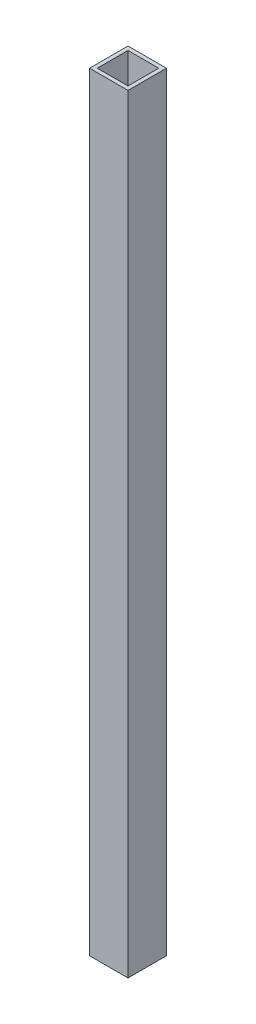
ISO-10303-21;
HEADER;
FILE_DESCRIPTION(('STEP AP214'),'2;1');
FILE_NAME('part.step','',(''),(''),'','','');
FILE_SCHEMA(('AUTOMOTIVE_DESIGN { 1 0 10303 214 1 1 1 1 }'));
ENDSEC;
DATA;
#1=APPLICATION_CONTEXT('core data for automotive mechanical design processes');
#2=APPLICATION_PROTOCOL_DEFINITION('international standard','automotive_design',2000,#1);
#3=PRODUCT_CONTEXT('',#1,'mechanical');
#4=PRODUCT('Part','Part','',(#3));
#5=PRODUCT_RELATED_PRODUCT_CATEGORY('part','',(#4));
#6=PRODUCT_DEFINITION_FORMATION('','',#4);
#7=PRODUCT_DEFINITION_CONTEXT('part definition',#1,'design');
#8=PRODUCT_DEFINITION('design','',#6,#7);
#9=PRODUCT_DEFINITION_SHAPE('','',#8);
#10=(LENGTH_UNIT() NAMED_UNIT(*) SI_UNIT(.MILLI.,.METRE.));
#11=(NAMED_UNIT(*) PLANE_ANGLE_UNIT() SI_UNIT($,.RADIAN.));
#12=(NAMED_UNIT(*) SI_UNIT($,.STERADIAN.) SOLID_ANGLE_UNIT());
#13=UNCERTAINTY_MEASURE_WITH_UNIT(LENGTH_MEASURE(1.E-05),#10,'distance_accuracy_value','');
#14=(GEOMETRIC_REPRESENTATION_CONTEXT(3) GLOBAL_UNCERTAINTY_ASSIGNED_CONTEXT((#13)) GLOBAL_UNIT_ASSIGNED_CONTEXT((#10,
#11,#12)) REPRESENTATION_CONTEXT('',''));
#15=CARTESIAN_POINT('',(0.,0.,0.));
#16=DIRECTION('',(0.,0.,1.));
#17=DIRECTION('',(1.,0.,0.));
#18=AXIS2_PLACEMENT_3D('',#15,#16,#17);
#19=CARTESIAN_POINT('',(0.,400.,0.));
#20=DIRECTION('',(0.,-1.,0.));
#21=DIRECTION('',(0.,0.,-1.));
#22=AXIS2_PLACEMENT_3D('',#19,#20,#21);
#23=PLANE('',#22);
#24=DIRECTION('',(0.,0.,-1.));
#25=VECTOR('',#24,1.);
#26=CARTESIAN_POINT('',(10.,400.,10.));
#27=LINE('',#26,#25);
#28=CARTESIAN_POINT('',(10.,400.,10.));
#29=VERTEX_POINT('',#28);
#30=CARTESIAN_POINT('',(10.,400.,-10.));
#31=VERTEX_POINT('',#30);
#32=EDGE_CURVE('E153',#29,#31,#27,.T.);
#33=ORIENTED_EDGE('',*,*,#32,.T.);
#34=DIRECTION('',(-1.,0.,0.));
#35=VECTOR('',#34,1.);
#36=CARTESIAN_POINT('',(-10.,400.,-10.));
#37=LINE('',#36,#35);
#38=CARTESIAN_POINT('',(-10.,400.,-10.));
#39=VERTEX_POINT('',#38);
#40=EDGE_CURVE('E157',#31,#39,#37,.T.);
#41=ORIENTED_EDGE('',*,*,#40,.T.);
#42=DIRECTION('',(0.,0.,1.));
#43=VECTOR('',#42,1.);
#44=CARTESIAN_POINT('',(-10.,400.,10.));
#45=LINE('',#44,#43);
#46=CARTESIAN_POINT('',(-10.,400.,10.));
#47=VERTEX_POINT('',#46);
#48=EDGE_CURVE('E161',#39,#47,#45,.T.);
#49=ORIENTED_EDGE('',*,*,#48,.T.);
#50=DIRECTION('',(1.,0.,0.));
#51=VECTOR('',#50,1.);
#52=CARTESIAN_POINT('',(-10.,400.,10.));
#53=LINE('',#52,#51);
#54=EDGE_CURVE('E164',#47,#29,#53,.T.);
#55=ORIENTED_EDGE('',*,*,#54,.T.);
#56=EDGE_LOOP('',(#33,#41,#49,#55));
#57=FACE_BOUND('',#56,.T.);
#58=DIRECTION('',(0.,0.,1.));
#59=VECTOR('',#58,1.);
#60=CARTESIAN_POINT('',(-8.,400.,8.));
#61=LINE('',#60,#59);
#62=CARTESIAN_POINT('',(-8.,400.,-8.));
#63=VERTEX_POINT('',#62);
#64=CARTESIAN_POINT('',(-8.,400.,8.));
#65=VERTEX_POINT('',#64);
#66=EDGE_CURVE('E105',#63,#65,#61,.T.);
#67=ORIENTED_EDGE('',*,*,#66,.F.);
#68=DIRECTION('',(-1.,0.,0.));
#69=VECTOR('',#68,1.);
#70=CARTESIAN_POINT('',(-8.,400.,-8.));
#71=LINE('',#70,#69);
#72=CARTESIAN_POINT('',(8.,400.,-8.));
#73=VERTEX_POINT('',#72);
#74=EDGE_CURVE('E131',#73,#63,#71,.T.);
#75=ORIENTED_EDGE('',*,*,#74,.F.);
#76=DIRECTION('',(0.,0.,-1.));
#77=VECTOR('',#76,1.);
#78=CARTESIAN_POINT('',(8.,400.,8.));
#79=LINE('',#78,#77);
#80=CARTESIAN_POINT('',(8.,400.,8.));
#81=VERTEX_POINT('',#80);
#82=EDGE_CURVE('E127',#81,#73,#79,.T.);
#83=ORIENTED_EDGE('',*,*,#82,.F.);
#84=DIRECTION('',(1.,0.,0.));
#85=VECTOR('',#84,1.);
#86=CARTESIAN_POINT('',(-8.,400.,8.));
#87=LINE('',#86,#85);
#88=EDGE_CURVE('E114',#65,#81,#87,.T.);
#89=ORIENTED_EDGE('',*,*,#88,.F.);
#90=EDGE_LOOP('',(#67,#75,#83,#89));
#91=FACE_BOUND('',#90,.T.);
#92=ADVANCED_FACE('F39',(#57,#91),#23,.F.);
#93=CARTESIAN_POINT('',(0.,0.,0.));
#94=DIRECTION('',(0.,-1.,0.));
#95=DIRECTION('',(0.,0.,-1.));
#96=AXIS2_PLACEMENT_3D('',#93,#94,#95);
#97=PLANE('',#96);
#98=DIRECTION('',(0.,0.,-1.));
#99=VECTOR('',#98,1.);
#100=CARTESIAN_POINT('',(10.,0.,10.));
#101=LINE('',#100,#99);
#102=CARTESIAN_POINT('',(10.,0.,10.));
#103=VERTEX_POINT('',#102);
#104=CARTESIAN_POINT('',(10.,0.,-10.));
#105=VERTEX_POINT('',#104);
#106=EDGE_CURVE('E123',#103,#105,#101,.T.);
#107=ORIENTED_EDGE('',*,*,#106,.F.);
#108=DIRECTION('',(1.,0.,0.));
#109=VECTOR('',#108,1.);
#110=CARTESIAN_POINT('',(-10.,0.,10.));
#111=LINE('',#110,#109);
#112=CARTESIAN_POINT('',(-10.,0.,10.));
#113=VERTEX_POINT('',#112);
#114=EDGE_CURVE('E158',#113,#103,#111,.T.);
#115=ORIENTED_EDGE('',*,*,#114,.F.);
#116=DIRECTION('',(0.,0.,1.));
#117=VECTOR('',#116,1.);
#118=CARTESIAN_POINT('',(-10.,0.,10.));
#119=LINE('',#118,#117);
#120=CARTESIAN_POINT('',(-10.,0.,-10.));
#121=VERTEX_POINT('',#120);
#122=EDGE_CURVE('E174',#121,#113,#119,.T.);
#123=ORIENTED_EDGE('',*,*,#122,.F.);
#124=DIRECTION('',(-1.,0.,0.));
#125=VECTOR('',#124,1.);
#126=CARTESIAN_POINT('',(-10.,0.,-10.));
#127=LINE('',#126,#125);
#128=EDGE_CURVE('E171',#105,#121,#127,.T.);
#129=ORIENTED_EDGE('',*,*,#128,.F.);
#130=EDGE_LOOP('',(#107,#115,#123,#129));
#131=FACE_BOUND('',#130,.T.);
#132=DIRECTION('',(-1.,0.,0.));
#133=VECTOR('',#132,1.);
#134=CARTESIAN_POINT('',(-8.,0.,-8.));
#135=LINE('',#134,#133);
#136=CARTESIAN_POINT('',(8.,0.,-8.));
#137=VERTEX_POINT('',#136);
#138=CARTESIAN_POINT('',(-8.,0.,-8.));
#139=VERTEX_POINT('',#138);
#140=EDGE_CURVE('E115',#137,#139,#135,.T.);
#141=ORIENTED_EDGE('',*,*,#140,.T.);
#142=DIRECTION('',(0.,0.,1.));
#143=VECTOR('',#142,1.);
#144=CARTESIAN_POINT('',(-8.,0.,8.));
#145=LINE('',#144,#143);
#146=CARTESIAN_POINT('',(-8.,0.,8.));
#147=VERTEX_POINT('',#146);
#148=EDGE_CURVE('E63',#139,#147,#145,.T.);
#149=ORIENTED_EDGE('',*,*,#148,.T.);
#150=DIRECTION('',(1.,0.,0.));
#151=VECTOR('',#150,1.);
#152=CARTESIAN_POINT('',(-8.,0.,8.));
#153=LINE('',#152,#151);
#154=CARTESIAN_POINT('',(8.,0.,8.));
#155=VERTEX_POINT('',#154);
#156=EDGE_CURVE('E121',#147,#155,#153,.T.);
#157=ORIENTED_EDGE('',*,*,#156,.T.);
#158=DIRECTION('',(0.,0.,-1.));
#159=VECTOR('',#158,1.);
#160=CARTESIAN_POINT('',(8.,0.,8.));
#161=LINE('',#160,#159);
#162=EDGE_CURVE('E140',#155,#137,#161,.T.);
#163=ORIENTED_EDGE('',*,*,#162,.T.);
#164=EDGE_LOOP('',(#141,#149,#157,#163));
#165=FACE_BOUND('',#164,.T.);
#166=ADVANCED_FACE('F197',(#131,#165),#97,.T.);
#167=CARTESIAN_POINT('',(10.,400.,10.));
#168=DIRECTION('',(-1.,0.,0.));
#169=DIRECTION('',(0.,0.,1.));
#170=AXIS2_PLACEMENT_3D('',#167,#168,#169);
#171=PLANE('',#170);
#172=ORIENTED_EDGE('',*,*,#106,.T.);
#173=DIRECTION('',(0.,-1.,0.));
#174=VECTOR('',#173,1.);
#175=CARTESIAN_POINT('',(10.,400.,-10.));
#176=LINE('',#175,#174);
#177=EDGE_CURVE('E11',#31,#105,#176,.T.);
#178=ORIENTED_EDGE('',*,*,#177,.F.);
#179=ORIENTED_EDGE('',*,*,#32,.F.);
#180=DIRECTION('',(0.,-1.,0.));
#181=VECTOR('',#180,1.);
#182=CARTESIAN_POINT('',(10.,400.,10.));
#183=LINE('',#182,#181);
#184=EDGE_CURVE('E167',#29,#103,#183,.T.);
#185=ORIENTED_EDGE('',*,*,#184,.T.);
#186=EDGE_LOOP('',(#172,#178,#179,#185));
#187=FACE_BOUND('',#186,.T.);
#188=ADVANCED_FACE('F41',(#187),#171,.F.);
#189=CARTESIAN_POINT('',(-10.,400.,-10.));
#190=DIRECTION('',(0.,0.,1.));
#191=DIRECTION('',(1.,0.,0.));
#192=AXIS2_PLACEMENT_3D('',#189,#190,#191);
#193=PLANE('',#192);
#194=ORIENTED_EDGE('',*,*,#128,.T.);
#195=DIRECTION('',(0.,-1.,0.));
#196=VECTOR('',#195,1.);
#197=CARTESIAN_POINT('',(-10.,400.,-10.));
#198=LINE('',#197,#196);
#199=EDGE_CURVE('E48',#39,#121,#198,.T.);
#200=ORIENTED_EDGE('',*,*,#199,.F.);
#201=ORIENTED_EDGE('',*,*,#40,.F.);
#202=ORIENTED_EDGE('',*,*,#177,.T.);
#203=EDGE_LOOP('',(#194,#200,#201,#202));
#204=FACE_BOUND('',#203,.T.);
#205=ADVANCED_FACE('F207',(#204),#193,.F.);
#206=CARTESIAN_POINT('',(-10.,400.,10.));
#207=DIRECTION('',(1.,0.,0.));
#208=DIRECTION('',(0.,0.,-1.));
#209=AXIS2_PLACEMENT_3D('',#206,#207,#208);
#210=PLANE('',#209);
#211=ORIENTED_EDGE('',*,*,#122,.T.);
#212=DIRECTION('',(0.,-1.,0.));
#213=VECTOR('',#212,1.);
#214=CARTESIAN_POINT('',(-10.,400.,10.));
#215=LINE('',#214,#213);
#216=EDGE_CURVE('E182',#47,#113,#215,.T.);
#217=ORIENTED_EDGE('',*,*,#216,.F.);
#218=ORIENTED_EDGE('',*,*,#48,.F.);
#219=ORIENTED_EDGE('',*,*,#199,.T.);
#220=EDGE_LOOP('',(#211,#217,#218,#219));
#221=FACE_BOUND('',#220,.T.);
#222=ADVANCED_FACE('F191',(#221),#210,.F.);
#223=CARTESIAN_POINT('',(-10.,400.,10.));
#224=DIRECTION('',(0.,0.,-1.));
#225=DIRECTION('',(-1.,0.,0.));
#226=AXIS2_PLACEMENT_3D('',#223,#224,#225);
#227=PLANE('',#226);
#228=ORIENTED_EDGE('',*,*,#114,.T.);
#229=ORIENTED_EDGE('',*,*,#184,.F.);
#230=ORIENTED_EDGE('',*,*,#54,.F.);
#231=ORIENTED_EDGE('',*,*,#216,.T.);
#232=EDGE_LOOP('',(#228,#229,#230,#231));
#233=FACE_BOUND('',#232,.T.);
#234=ADVANCED_FACE('F201',(#233),#227,.F.);
#235=CARTESIAN_POINT('',(-8.,400.,8.));
#236=DIRECTION('',(1.,0.,0.));
#237=DIRECTION('',(0.,0.,-1.));
#238=AXIS2_PLACEMENT_3D('',#235,#236,#237);
#239=PLANE('',#238);
#240=ORIENTED_EDGE('',*,*,#148,.F.);
#241=DIRECTION('',(0.,-1.,0.));
#242=VECTOR('',#241,1.);
#243=CARTESIAN_POINT('',(-8.,400.,-8.));
#244=LINE('',#243,#242);
#245=EDGE_CURVE('E109',#63,#139,#244,.T.);
#246=ORIENTED_EDGE('',*,*,#245,.F.);
#247=ORIENTED_EDGE('',*,*,#66,.T.);
#248=DIRECTION('',(0.,-1.,0.));
#249=VECTOR('',#248,1.);
#250=CARTESIAN_POINT('',(-8.,400.,8.));
#251=LINE('',#250,#249);
#252=EDGE_CURVE('E108',#65,#147,#251,.T.);
#253=ORIENTED_EDGE('',*,*,#252,.T.);
#254=EDGE_LOOP('',(#240,#246,#247,#253));
#255=FACE_BOUND('',#254,.T.);
#256=ADVANCED_FACE('F107',(#255),#239,.T.);
#257=CARTESIAN_POINT('',(-8.,400.,8.));
#258=DIRECTION('',(0.,0.,-1.));
#259=DIRECTION('',(-1.,0.,0.));
#260=AXIS2_PLACEMENT_3D('',#257,#258,#259);
#261=PLANE('',#260);
#262=ORIENTED_EDGE('',*,*,#156,.F.);
#263=ORIENTED_EDGE('',*,*,#252,.F.);
#264=ORIENTED_EDGE('',*,*,#88,.T.);
#265=DIRECTION('',(0.,-1.,0.));
#266=VECTOR('',#265,1.);
#267=CARTESIAN_POINT('',(8.,400.,8.));
#268=LINE('',#267,#266);
#269=EDGE_CURVE('E124',#81,#155,#268,.T.);
#270=ORIENTED_EDGE('',*,*,#269,.T.);
#271=EDGE_LOOP('',(#262,#263,#264,#270));
#272=FACE_BOUND('',#271,.T.);
#273=ADVANCED_FACE('F118',(#272),#261,.T.);
#274=CARTESIAN_POINT('',(8.,400.,8.));
#275=DIRECTION('',(-1.,0.,0.));
#276=DIRECTION('',(0.,0.,1.));
#277=AXIS2_PLACEMENT_3D('',#274,#275,#276);
#278=PLANE('',#277);
#279=ORIENTED_EDGE('',*,*,#162,.F.);
#280=ORIENTED_EDGE('',*,*,#269,.F.);
#281=ORIENTED_EDGE('',*,*,#82,.T.);
#282=DIRECTION('',(0.,-1.,0.));
#283=VECTOR('',#282,1.);
#284=CARTESIAN_POINT('',(8.,400.,-8.));
#285=LINE('',#284,#283);
#286=EDGE_CURVE('E55',#73,#137,#285,.T.);
#287=ORIENTED_EDGE('',*,*,#286,.T.);
#288=EDGE_LOOP('',(#279,#280,#281,#287));
#289=FACE_BOUND('',#288,.T.);
#290=ADVANCED_FACE('F230',(#289),#278,.T.);
#291=CARTESIAN_POINT('',(-8.,400.,-8.));
#292=DIRECTION('',(0.,0.,1.));
#293=DIRECTION('',(1.,0.,0.));
#294=AXIS2_PLACEMENT_3D('',#291,#292,#293);
#295=PLANE('',#294);
#296=ORIENTED_EDGE('',*,*,#140,.F.);
#297=ORIENTED_EDGE('',*,*,#286,.F.);
#298=ORIENTED_EDGE('',*,*,#74,.T.);
#299=ORIENTED_EDGE('',*,*,#245,.T.);
#300=EDGE_LOOP('',(#296,#297,#298,#299));
#301=FACE_BOUND('',#300,.T.);
#302=ADVANCED_FACE('F234',(#301),#295,.T.);
#303=CLOSED_SHELL('',(#92,#166,#188,#205,#222,#234,#256,#273,#290,#302));
#304=MANIFOLD_SOLID_BREP('B2',#303);
#305=ADVANCED_BREP_SHAPE_REPRESENTATION('',(#18,#304),#14);
#306=SHAPE_DEFINITION_REPRESENTATION(#9,#305);
ENDSEC;
END-ISO-10303-21;
